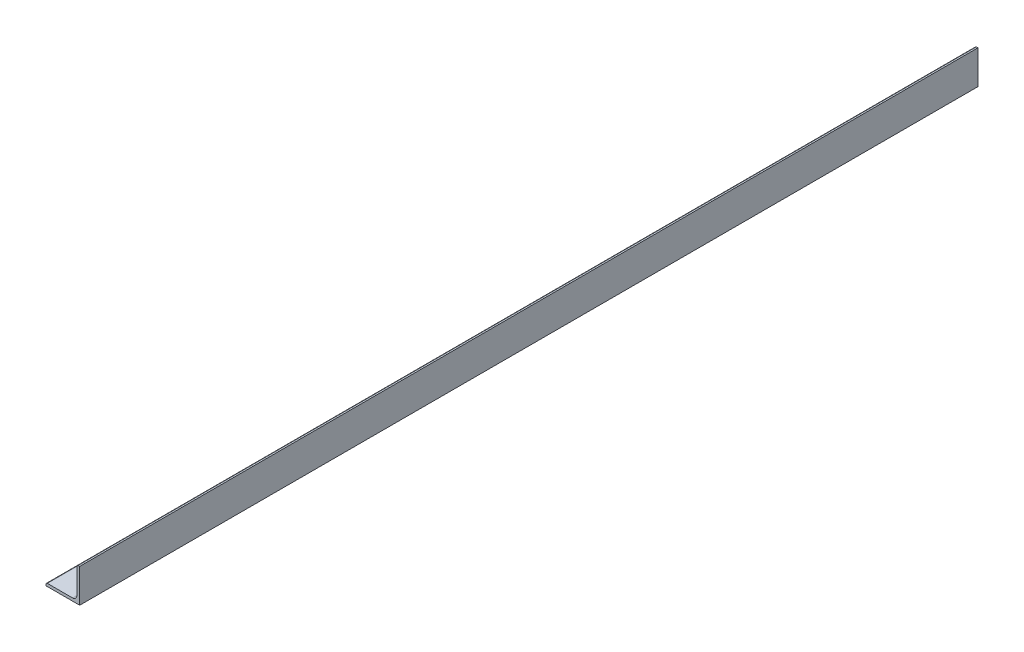
ISO-10303-21;
HEADER;
FILE_DESCRIPTION(('STEP AP214'),'2;1');
FILE_NAME('part.step','',(''),(''),'','','');
FILE_SCHEMA(('AUTOMOTIVE_DESIGN { 1 0 10303 214 1 1 1 1 }'));
ENDSEC;
DATA;
#1=APPLICATION_CONTEXT('core data for automotive mechanical design processes');
#2=APPLICATION_PROTOCOL_DEFINITION('international standard','automotive_design',2000,#1);
#3=PRODUCT_CONTEXT('',#1,'mechanical');
#4=PRODUCT('Part','Part','',(#3));
#5=PRODUCT_RELATED_PRODUCT_CATEGORY('part','',(#4));
#6=PRODUCT_DEFINITION_FORMATION('','',#4);
#7=PRODUCT_DEFINITION_CONTEXT('part definition',#1,'design');
#8=PRODUCT_DEFINITION('design','',#6,#7);
#9=PRODUCT_DEFINITION_SHAPE('','',#8);
#10=(LENGTH_UNIT() NAMED_UNIT(*) SI_UNIT(.MILLI.,.METRE.));
#11=(NAMED_UNIT(*) PLANE_ANGLE_UNIT() SI_UNIT($,.RADIAN.));
#12=(NAMED_UNIT(*) SI_UNIT($,.STERADIAN.) SOLID_ANGLE_UNIT());
#13=UNCERTAINTY_MEASURE_WITH_UNIT(LENGTH_MEASURE(1.E-05),#10,'distance_accuracy_value','');
#14=(GEOMETRIC_REPRESENTATION_CONTEXT(3) GLOBAL_UNCERTAINTY_ASSIGNED_CONTEXT((#13)) GLOBAL_UNIT_ASSIGNED_CONTEXT((#10,
#11,#12)) REPRESENTATION_CONTEXT('',''));
#15=CARTESIAN_POINT('',(0.,0.,0.));
#16=DIRECTION('',(0.,0.,1.));
#17=DIRECTION('',(1.,0.,0.));
#18=AXIS2_PLACEMENT_3D('',#15,#16,#17);
#19=CARTESIAN_POINT('',(-9.525,-8.73125000000001,254.));
#20=DIRECTION('',(1.,0.,0.));
#21=DIRECTION('',(0.,0.,-1.));
#22=AXIS2_PLACEMENT_3D('',#19,#20,#21);
#23=PLANE('',#22);
#24=DIRECTION('',(0.,-1.,0.));
#25=VECTOR('',#24,1.);
#26=CARTESIAN_POINT('',(-9.525,-8.73125000000001,-254.));
#27=LINE('',#26,#25);
#28=CARTESIAN_POINT('',(-9.525,-8.73125000000001,-254.));
#29=VERTEX_POINT('',#28);
#30=CARTESIAN_POINT('',(-9.525,-9.525,-254.));
#31=VERTEX_POINT('',#30);
#32=EDGE_CURVE('E152',#29,#31,#27,.T.);
#33=ORIENTED_EDGE('',*,*,#32,.T.);
#34=DIRECTION('',(0.,0.,-1.));
#35=VECTOR('',#34,1.);
#36=CARTESIAN_POINT('',(-9.525,-9.525,254.));
#37=LINE('',#36,#35);
#38=CARTESIAN_POINT('',(-9.525,-9.525,254.));
#39=VERTEX_POINT('',#38);
#40=EDGE_CURVE('E11',#39,#31,#37,.T.);
#41=ORIENTED_EDGE('',*,*,#40,.F.);
#42=DIRECTION('',(0.,-1.,0.));
#43=VECTOR('',#42,1.);
#44=CARTESIAN_POINT('',(-9.525,-8.73125000000001,254.));
#45=LINE('',#44,#43);
#46=CARTESIAN_POINT('',(-9.525,-8.73125000000001,254.));
#47=VERTEX_POINT('',#46);
#48=EDGE_CURVE('E177',#47,#39,#45,.T.);
#49=ORIENTED_EDGE('',*,*,#48,.F.);
#50=DIRECTION('',(0.,0.,-1.));
#51=VECTOR('',#50,1.);
#52=CARTESIAN_POINT('',(-9.525,-8.73125000000001,254.));
#53=LINE('',#52,#51);
#54=EDGE_CURVE('E148',#47,#29,#53,.T.);
#55=ORIENTED_EDGE('',*,*,#54,.T.);
#56=EDGE_LOOP('',(#33,#41,#49,#55));
#57=FACE_BOUND('',#56,.T.);
#58=ADVANCED_FACE('F45',(#57),#23,.F.);
#59=CARTESIAN_POINT('',(-9.525,-9.525,254.));
#60=DIRECTION('',(0.,1.,0.));
#61=DIRECTION('',(-1.,0.,0.));
#62=AXIS2_PLACEMENT_3D('',#59,#60,#61);
#63=PLANE('',#62);
#64=DIRECTION('',(1.,0.,0.));
#65=VECTOR('',#64,1.);
#66=CARTESIAN_POINT('',(-9.525,-9.525,-254.));
#67=LINE('',#66,#65);
#68=CARTESIAN_POINT('',(9.525,-9.525,-254.));
#69=VERTEX_POINT('',#68);
#70=EDGE_CURVE('E156',#31,#69,#67,.T.);
#71=ORIENTED_EDGE('',*,*,#70,.T.);
#72=DIRECTION('',(0.,0.,-1.));
#73=VECTOR('',#72,1.);
#74=CARTESIAN_POINT('',(9.525,-9.525,254.));
#75=LINE('',#74,#73);
#76=CARTESIAN_POINT('',(9.525,-9.525,254.));
#77=VERTEX_POINT('',#76);
#78=EDGE_CURVE('E54',#77,#69,#75,.T.);
#79=ORIENTED_EDGE('',*,*,#78,.F.);
#80=DIRECTION('',(1.,0.,0.));
#81=VECTOR('',#80,1.);
#82=CARTESIAN_POINT('',(-9.525,-9.525,254.));
#83=LINE('',#82,#81);
#84=EDGE_CURVE('E108',#39,#77,#83,.T.);
#85=ORIENTED_EDGE('',*,*,#84,.F.);
#86=ORIENTED_EDGE('',*,*,#40,.T.);
#87=EDGE_LOOP('',(#71,#79,#85,#86));
#88=FACE_BOUND('',#87,.T.);
#89=ADVANCED_FACE('F233',(#88),#63,.F.);
#90=CARTESIAN_POINT('',(9.525,-9.525,254.));
#91=DIRECTION('',(-1.,0.,0.));
#92=DIRECTION('',(0.,-1.,0.));
#93=AXIS2_PLACEMENT_3D('',#90,#91,#92);
#94=PLANE('',#93);
#95=DIRECTION('',(0.,1.,0.));
#96=VECTOR('',#95,1.);
#97=CARTESIAN_POINT('',(9.525,-9.525,-254.));
#98=LINE('',#97,#96);
#99=CARTESIAN_POINT('',(9.525,9.525,-254.));
#100=VERTEX_POINT('',#99);
#101=EDGE_CURVE('E159',#69,#100,#98,.T.);
#102=ORIENTED_EDGE('',*,*,#101,.T.);
#103=DIRECTION('',(0.,0.,-1.));
#104=VECTOR('',#103,1.);
#105=CARTESIAN_POINT('',(9.525,9.525,254.));
#106=LINE('',#105,#104);
#107=CARTESIAN_POINT('',(9.525,9.525,254.));
#108=VERTEX_POINT('',#107);
#109=EDGE_CURVE('E192',#108,#100,#106,.T.);
#110=ORIENTED_EDGE('',*,*,#109,.F.);
#111=DIRECTION('',(0.,1.,0.));
#112=VECTOR('',#111,1.);
#113=CARTESIAN_POINT('',(9.525,-9.525,254.));
#114=LINE('',#113,#112);
#115=EDGE_CURVE('E202',#77,#108,#114,.T.);
#116=ORIENTED_EDGE('',*,*,#115,.F.);
#117=ORIENTED_EDGE('',*,*,#78,.T.);
#118=EDGE_LOOP('',(#102,#110,#116,#117));
#119=FACE_BOUND('',#118,.T.);
#120=ADVANCED_FACE('F200',(#119),#94,.F.);
#121=CARTESIAN_POINT('',(8.73125000000001,9.525,254.));
#122=DIRECTION('',(0.,-1.,0.));
#123=DIRECTION('',(1.,0.,0.));
#124=AXIS2_PLACEMENT_3D('',#121,#122,#123);
#125=PLANE('',#124);
#126=DIRECTION('',(-1.,0.,0.));
#127=VECTOR('',#126,1.);
#128=CARTESIAN_POINT('',(8.73125000000001,9.525,-254.));
#129=LINE('',#128,#127);
#130=CARTESIAN_POINT('',(8.73125000000001,9.525,-254.));
#131=VERTEX_POINT('',#130);
#132=EDGE_CURVE('E162',#100,#131,#129,.T.);
#133=ORIENTED_EDGE('',*,*,#132,.T.);
#134=DIRECTION('',(0.,0.,-1.));
#135=VECTOR('',#134,1.);
#136=CARTESIAN_POINT('',(8.73125000000001,9.525,254.));
#137=LINE('',#136,#135);
#138=CARTESIAN_POINT('',(8.73125000000001,9.525,254.));
#139=VERTEX_POINT('',#138);
#140=EDGE_CURVE('E188',#139,#131,#137,.T.);
#141=ORIENTED_EDGE('',*,*,#140,.F.);
#142=DIRECTION('',(-1.,0.,0.));
#143=VECTOR('',#142,1.);
#144=CARTESIAN_POINT('',(8.73125000000001,9.525,254.));
#145=LINE('',#144,#143);
#146=EDGE_CURVE('E219',#108,#139,#145,.T.);
#147=ORIENTED_EDGE('',*,*,#146,.F.);
#148=ORIENTED_EDGE('',*,*,#109,.T.);
#149=EDGE_LOOP('',(#133,#141,#147,#148));
#150=FACE_BOUND('',#149,.T.);
#151=ADVANCED_FACE('F211',(#150),#125,.F.);
#152=CARTESIAN_POINT('',(8.73125000000001,8.73125000000002,254.));
#153=DIRECTION('',(0.,0.,-1.));
#154=DIRECTION('',(-1.,0.,0.));
#155=AXIS2_PLACEMENT_3D('',#152,#153,#154);
#156=CYLINDRICAL_SURFACE('',#155,0.793749999999986);
#157=CARTESIAN_POINT('',(8.73125000000001,8.73125000000002,-254.));
#158=DIRECTION('',(0.,0.,1.));
#159=DIRECTION('',(-1.,0.,0.));
#160=AXIS2_PLACEMENT_3D('',#157,#158,#159);
#161=CIRCLE('',#160,0.793749999999986);
#162=CARTESIAN_POINT('',(7.93750000000003,8.73125000000002,-254.));
#163=VERTEX_POINT('',#162);
#164=EDGE_CURVE('E165',#131,#163,#161,.T.);
#165=ORIENTED_EDGE('',*,*,#164,.T.);
#166=DIRECTION('',(0.,0.,-1.));
#167=VECTOR('',#166,1.);
#168=CARTESIAN_POINT('',(7.93750000000003,8.73125000000002,254.));
#169=LINE('',#168,#167);
#170=CARTESIAN_POINT('',(7.93750000000003,8.73125000000002,254.));
#171=VERTEX_POINT('',#170);
#172=EDGE_CURVE('E184',#171,#163,#169,.T.);
#173=ORIENTED_EDGE('',*,*,#172,.F.);
#174=CARTESIAN_POINT('',(8.73125000000001,8.73125000000002,254.));
#175=DIRECTION('',(0.,0.,1.));
#176=DIRECTION('',(-1.,0.,0.));
#177=AXIS2_PLACEMENT_3D('',#174,#175,#176);
#178=CIRCLE('',#177,0.793749999999986);
#179=EDGE_CURVE('E217',#139,#171,#178,.T.);
#180=ORIENTED_EDGE('',*,*,#179,.F.);
#181=ORIENTED_EDGE('',*,*,#140,.T.);
#182=EDGE_LOOP('',(#165,#173,#180,#181));
#183=FACE_BOUND('',#182,.T.);
#184=ADVANCED_FACE('F215',(#183),#156,.T.);
#185=CARTESIAN_POINT('',(7.93750000000003,8.73125000000002,254.));
#186=DIRECTION('',(1.,0.,0.));
#187=DIRECTION('',(0.,1.,0.));
#188=AXIS2_PLACEMENT_3D('',#185,#186,#187);
#189=PLANE('',#188);
#190=DIRECTION('',(0.,-1.,0.));
#191=VECTOR('',#190,1.);
#192=CARTESIAN_POINT('',(7.93750000000003,8.73125000000002,-254.));
#193=LINE('',#192,#191);
#194=CARTESIAN_POINT('',(7.93750000000003,-5.54990000000002,-254.));
#195=VERTEX_POINT('',#194);
#196=EDGE_CURVE('E168',#163,#195,#193,.T.);
#197=ORIENTED_EDGE('',*,*,#196,.T.);
#198=DIRECTION('',(0.,0.,-1.));
#199=VECTOR('',#198,1.);
#200=CARTESIAN_POINT('',(7.93750000000003,-5.54990000000002,254.));
#201=LINE('',#200,#199);
#202=CARTESIAN_POINT('',(7.93750000000003,-5.54990000000002,254.));
#203=VERTEX_POINT('',#202);
#204=EDGE_CURVE('E141',#203,#195,#201,.T.);
#205=ORIENTED_EDGE('',*,*,#204,.F.);
#206=DIRECTION('',(0.,-1.,0.));
#207=VECTOR('',#206,1.);
#208=CARTESIAN_POINT('',(7.93750000000003,8.73125000000002,254.));
#209=LINE('',#208,#207);
#210=EDGE_CURVE('E130',#171,#203,#209,.T.);
#211=ORIENTED_EDGE('',*,*,#210,.F.);
#212=ORIENTED_EDGE('',*,*,#172,.T.);
#213=EDGE_LOOP('',(#197,#205,#211,#212));
#214=FACE_BOUND('',#213,.T.);
#215=ADVANCED_FACE('F245',(#214),#189,.F.);
#216=CARTESIAN_POINT('',(5.54990000000003,-5.54990000000002,254.));
#217=DIRECTION('',(0.,0.,-1.));
#218=DIRECTION('',(-1.,0.,0.));
#219=AXIS2_PLACEMENT_3D('',#216,#217,#218);
#220=CYLINDRICAL_SURFACE('',#219,2.3876);
#221=CARTESIAN_POINT('',(5.54990000000003,-5.54990000000002,-254.));
#222=DIRECTION('',(0.,0.,-1.));
#223=DIRECTION('',(-1.,0.,0.));
#224=AXIS2_PLACEMENT_3D('',#221,#222,#223);
#225=CIRCLE('',#224,2.3876);
#226=CARTESIAN_POINT('',(5.54990000000003,-7.93750000000002,-254.));
#227=VERTEX_POINT('',#226);
#228=EDGE_CURVE('E139',#195,#227,#225,.T.);
#229=ORIENTED_EDGE('',*,*,#228,.T.);
#230=DIRECTION('',(0.,0.,-1.));
#231=VECTOR('',#230,1.);
#232=CARTESIAN_POINT('',(5.54990000000003,-7.93750000000002,254.));
#233=LINE('',#232,#231);
#234=CARTESIAN_POINT('',(5.54990000000003,-7.93750000000002,254.));
#235=VERTEX_POINT('',#234);
#236=EDGE_CURVE('E136',#235,#227,#233,.T.);
#237=ORIENTED_EDGE('',*,*,#236,.F.);
#238=CARTESIAN_POINT('',(5.54990000000003,-5.54990000000002,254.));
#239=DIRECTION('',(0.,0.,-1.));
#240=DIRECTION('',(-1.,0.,0.));
#241=AXIS2_PLACEMENT_3D('',#238,#239,#240);
#242=CIRCLE('',#241,2.3876);
#243=EDGE_CURVE('E124',#203,#235,#242,.T.);
#244=ORIENTED_EDGE('',*,*,#243,.F.);
#245=ORIENTED_EDGE('',*,*,#204,.T.);
#246=EDGE_LOOP('',(#229,#237,#244,#245));
#247=FACE_BOUND('',#246,.T.);
#248=ADVANCED_FACE('F137',(#247),#220,.F.);
#249=CARTESIAN_POINT('',(5.54990000000003,-7.93750000000002,254.));
#250=DIRECTION('',(0.,-1.,0.));
#251=DIRECTION('',(1.,0.,0.));
#252=AXIS2_PLACEMENT_3D('',#249,#250,#251);
#253=PLANE('',#252);
#254=DIRECTION('',(-1.,0.,0.));
#255=VECTOR('',#254,1.);
#256=CARTESIAN_POINT('',(5.54990000000003,-7.93750000000002,-254.));
#257=LINE('',#256,#255);
#258=CARTESIAN_POINT('',(-8.73125000000001,-7.93750000000003,-254.));
#259=VERTEX_POINT('',#258);
#260=EDGE_CURVE('E94',#227,#259,#257,.T.);
#261=ORIENTED_EDGE('',*,*,#260,.T.);
#262=DIRECTION('',(0.,0.,-1.));
#263=VECTOR('',#262,1.);
#264=CARTESIAN_POINT('',(-8.73125000000001,-7.93750000000003,254.));
#265=LINE('',#264,#263);
#266=CARTESIAN_POINT('',(-8.73125000000001,-7.93750000000003,254.));
#267=VERTEX_POINT('',#266);
#268=EDGE_CURVE('E142',#267,#259,#265,.T.);
#269=ORIENTED_EDGE('',*,*,#268,.F.);
#270=DIRECTION('',(-1.,0.,0.));
#271=VECTOR('',#270,1.);
#272=CARTESIAN_POINT('',(5.54990000000003,-7.93750000000002,254.));
#273=LINE('',#272,#271);
#274=EDGE_CURVE('E128',#235,#267,#273,.T.);
#275=ORIENTED_EDGE('',*,*,#274,.F.);
#276=ORIENTED_EDGE('',*,*,#236,.T.);
#277=EDGE_LOOP('',(#261,#269,#275,#276));
#278=FACE_BOUND('',#277,.T.);
#279=ADVANCED_FACE('F144',(#278),#253,.F.);
#280=CARTESIAN_POINT('',(-8.73125000000001,-8.73125000000001,254.));
#281=DIRECTION('',(0.,0.,-1.));
#282=DIRECTION('',(-1.,0.,0.));
#283=AXIS2_PLACEMENT_3D('',#280,#281,#282);
#284=CYLINDRICAL_SURFACE('',#283,0.793749999999986);
#285=CARTESIAN_POINT('',(-8.73125000000001,-8.73125000000001,-254.));
#286=DIRECTION('',(0.,0.,1.));
#287=DIRECTION('',(-1.,0.,0.));
#288=AXIS2_PLACEMENT_3D('',#285,#286,#287);
#289=CIRCLE('',#288,0.793749999999986);
#290=EDGE_CURVE('E100',#259,#29,#289,.T.);
#291=ORIENTED_EDGE('',*,*,#290,.T.);
#292=ORIENTED_EDGE('',*,*,#54,.F.);
#293=CARTESIAN_POINT('',(-8.73125000000001,-8.73125000000001,254.));
#294=DIRECTION('',(0.,0.,1.));
#295=DIRECTION('',(-1.,0.,0.));
#296=AXIS2_PLACEMENT_3D('',#293,#294,#295);
#297=CIRCLE('',#296,0.793749999999986);
#298=EDGE_CURVE('E62',#267,#47,#297,.T.);
#299=ORIENTED_EDGE('',*,*,#298,.F.);
#300=ORIENTED_EDGE('',*,*,#268,.T.);
#301=EDGE_LOOP('',(#291,#292,#299,#300));
#302=FACE_BOUND('',#301,.T.);
#303=ADVANCED_FACE('F253',(#302),#284,.T.);
#304=CARTESIAN_POINT('',(8.73125000000001,8.73125000000002,254.));
#305=DIRECTION('',(0.,0.,-1.));
#306=DIRECTION('',(-1.,0.,0.));
#307=AXIS2_PLACEMENT_3D('',#304,#305,#306);
#308=PLANE('',#307);
#309=ORIENTED_EDGE('',*,*,#48,.T.);
#310=ORIENTED_EDGE('',*,*,#84,.T.);
#311=ORIENTED_EDGE('',*,*,#115,.T.);
#312=ORIENTED_EDGE('',*,*,#146,.T.);
#313=ORIENTED_EDGE('',*,*,#179,.T.);
#314=ORIENTED_EDGE('',*,*,#210,.T.);
#315=ORIENTED_EDGE('',*,*,#243,.T.);
#316=ORIENTED_EDGE('',*,*,#274,.T.);
#317=ORIENTED_EDGE('',*,*,#298,.T.);
#318=EDGE_LOOP('',(#309,#310,#311,#312,#313,#314,#315,#316,#317));
#319=FACE_BOUND('',#318,.T.);
#320=ADVANCED_FACE('F126',(#319),#308,.F.);
#321=CARTESIAN_POINT('',(8.73125000000001,8.73125000000002,-254.));
#322=DIRECTION('',(0.,0.,-1.));
#323=DIRECTION('',(-1.,0.,0.));
#324=AXIS2_PLACEMENT_3D('',#321,#322,#323);
#325=PLANE('',#324);
#326=ORIENTED_EDGE('',*,*,#32,.F.);
#327=ORIENTED_EDGE('',*,*,#290,.F.);
#328=ORIENTED_EDGE('',*,*,#260,.F.);
#329=ORIENTED_EDGE('',*,*,#228,.F.);
#330=ORIENTED_EDGE('',*,*,#196,.F.);
#331=ORIENTED_EDGE('',*,*,#164,.F.);
#332=ORIENTED_EDGE('',*,*,#132,.F.);
#333=ORIENTED_EDGE('',*,*,#101,.F.);
#334=ORIENTED_EDGE('',*,*,#70,.F.);
#335=EDGE_LOOP('',(#326,#327,#328,#329,#330,#331,#332,#333,#334));
#336=FACE_BOUND('',#335,.T.);
#337=ADVANCED_FACE('F206',(#336),#325,.T.);
#338=CLOSED_SHELL('',(#58,#89,#120,#151,#184,#215,#248,#279,#303,#320,#337));
#339=MANIFOLD_SOLID_BREP('B2',#338);
#340=ADVANCED_BREP_SHAPE_REPRESENTATION('',(#18,#339),#14);
#341=SHAPE_DEFINITION_REPRESENTATION(#9,#340);
ENDSEC;
END-ISO-10303-21;
